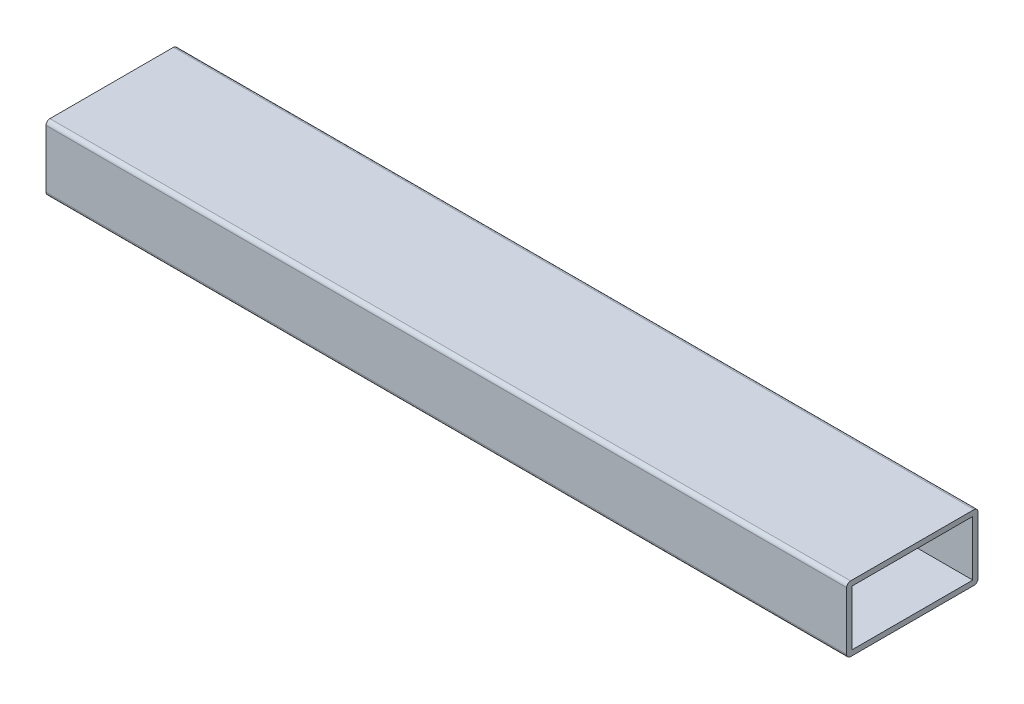
ISO-10303-21;
HEADER;
FILE_DESCRIPTION(('STEP AP214'),'2;1');
FILE_NAME('part.step','',(''),(''),'','','');
FILE_SCHEMA(('AUTOMOTIVE_DESIGN { 1 0 10303 214 1 1 1 1 }'));
ENDSEC;
DATA;
#1=APPLICATION_CONTEXT('core data for automotive mechanical design processes');
#2=APPLICATION_PROTOCOL_DEFINITION('international standard','automotive_design',2000,#1);
#3=PRODUCT_CONTEXT('',#1,'mechanical');
#4=PRODUCT('Part','Part','',(#3));
#5=PRODUCT_RELATED_PRODUCT_CATEGORY('part','',(#4));
#6=PRODUCT_DEFINITION_FORMATION('','',#4);
#7=PRODUCT_DEFINITION_CONTEXT('part definition',#1,'design');
#8=PRODUCT_DEFINITION('design','',#6,#7);
#9=PRODUCT_DEFINITION_SHAPE('','',#8);
#10=(LENGTH_UNIT() NAMED_UNIT(*) SI_UNIT(.MILLI.,.METRE.));
#11=(NAMED_UNIT(*) PLANE_ANGLE_UNIT() SI_UNIT($,.RADIAN.));
#12=(NAMED_UNIT(*) SI_UNIT($,.STERADIAN.) SOLID_ANGLE_UNIT());
#13=UNCERTAINTY_MEASURE_WITH_UNIT(LENGTH_MEASURE(1.E-05),#10,'distance_accuracy_value','');
#14=(GEOMETRIC_REPRESENTATION_CONTEXT(3) GLOBAL_UNCERTAINTY_ASSIGNED_CONTEXT((#13)) GLOBAL_UNIT_ASSIGNED_CONTEXT((#10,
#11,#12)) REPRESENTATION_CONTEXT('',''));
#15=CARTESIAN_POINT('',(0.,0.,0.));
#16=DIRECTION('',(0.,0.,1.));
#17=DIRECTION('',(1.,0.,0.));
#18=AXIS2_PLACEMENT_3D('',#15,#16,#17);
#19=CARTESIAN_POINT('',(152.4,-11.,23.5));
#20=DIRECTION('',(-1.,0.,0.));
#21=DIRECTION('',(0.,0.,1.));
#22=AXIS2_PLACEMENT_3D('',#19,#20,#21);
#23=PLANE('',#22);
#24=CARTESIAN_POINT('',(152.4,-11.,23.5));
#25=DIRECTION('',(1.,0.,0.));
#26=DIRECTION('',(0.,0.,1.));
#27=AXIS2_PLACEMENT_3D('',#24,#25,#26);
#28=CIRCLE('',#27,1.5);
#29=CARTESIAN_POINT('',(152.4,-11.,25.));
#30=VERTEX_POINT('',#29);
#31=CARTESIAN_POINT('',(152.4,-12.5,23.5));
#32=VERTEX_POINT('',#31);
#33=EDGE_CURVE('E159',#30,#32,#28,.T.);
#34=ORIENTED_EDGE('',*,*,#33,.T.);
#35=DIRECTION('',(0.,0.,-1.));
#36=VECTOR('',#35,1.);
#37=CARTESIAN_POINT('',(152.4,-12.5,23.5));
#38=LINE('',#37,#36);
#39=CARTESIAN_POINT('',(152.4,-12.5,-23.5));
#40=VERTEX_POINT('',#39);
#41=EDGE_CURVE('E162',#32,#40,#38,.T.);
#42=ORIENTED_EDGE('',*,*,#41,.T.);
#43=CARTESIAN_POINT('',(152.4,-11.,-23.5));
#44=DIRECTION('',(1.,0.,0.));
#45=DIRECTION('',(0.,0.,-1.));
#46=AXIS2_PLACEMENT_3D('',#43,#44,#45);
#47=CIRCLE('',#46,1.5);
#48=CARTESIAN_POINT('',(152.4,-11.,-25.));
#49=VERTEX_POINT('',#48);
#50=EDGE_CURVE('E165',#40,#49,#47,.T.);
#51=ORIENTED_EDGE('',*,*,#50,.T.);
#52=DIRECTION('',(0.,1.,0.));
#53=VECTOR('',#52,1.);
#54=CARTESIAN_POINT('',(152.4,11.,-25.));
#55=LINE('',#54,#53);
#56=CARTESIAN_POINT('',(152.4,11.,-25.));
#57=VERTEX_POINT('',#56);
#58=EDGE_CURVE('E167',#49,#57,#55,.T.);
#59=ORIENTED_EDGE('',*,*,#58,.T.);
#60=CARTESIAN_POINT('',(152.4,11.,-23.5));
#61=DIRECTION('',(1.,0.,0.));
#62=DIRECTION('',(0.,0.,-1.));
#63=AXIS2_PLACEMENT_3D('',#60,#61,#62);
#64=CIRCLE('',#63,1.5);
#65=CARTESIAN_POINT('',(152.4,12.5,-23.5));
#66=VERTEX_POINT('',#65);
#67=EDGE_CURVE('E169',#57,#66,#64,.T.);
#68=ORIENTED_EDGE('',*,*,#67,.T.);
#69=DIRECTION('',(0.,0.,1.));
#70=VECTOR('',#69,1.);
#71=CARTESIAN_POINT('',(152.4,12.5,23.5));
#72=LINE('',#71,#70);
#73=CARTESIAN_POINT('',(152.4,12.5,23.5));
#74=VERTEX_POINT('',#73);
#75=EDGE_CURVE('E171',#66,#74,#72,.T.);
#76=ORIENTED_EDGE('',*,*,#75,.T.);
#77=CARTESIAN_POINT('',(152.4,11.,23.5));
#78=DIRECTION('',(1.,0.,0.));
#79=DIRECTION('',(0.,0.,1.));
#80=AXIS2_PLACEMENT_3D('',#77,#78,#79);
#81=CIRCLE('',#80,1.5);
#82=CARTESIAN_POINT('',(152.4,11.,25.));
#83=VERTEX_POINT('',#82);
#84=EDGE_CURVE('E173',#74,#83,#81,.T.);
#85=ORIENTED_EDGE('',*,*,#84,.T.);
#86=DIRECTION('',(0.,-1.,0.));
#87=VECTOR('',#86,1.);
#88=CARTESIAN_POINT('',(152.4,11.,25.));
#89=LINE('',#88,#87);
#90=EDGE_CURVE('E175',#83,#30,#89,.T.);
#91=ORIENTED_EDGE('',*,*,#90,.T.);
#92=EDGE_LOOP('',(#34,#42,#51,#59,#68,#76,#85,#91));
#93=FACE_BOUND('',#92,.T.);
#94=DIRECTION('',(0.,-1.,0.));
#95=VECTOR('',#94,1.);
#96=CARTESIAN_POINT('',(152.4,-11.,23.));
#97=LINE('',#96,#95);
#98=CARTESIAN_POINT('',(152.4,10.5,23.));
#99=VERTEX_POINT('',#98);
#100=CARTESIAN_POINT('',(152.4,-10.5,23.));
#101=VERTEX_POINT('',#100);
#102=EDGE_CURVE('E128',#99,#101,#97,.T.);
#103=ORIENTED_EDGE('',*,*,#102,.F.);
#104=DIRECTION('',(0.,0.,1.));
#105=VECTOR('',#104,1.);
#106=CARTESIAN_POINT('',(152.4,10.5,23.5));
#107=LINE('',#106,#105);
#108=CARTESIAN_POINT('',(152.4,10.5,-23.));
#109=VERTEX_POINT('',#108);
#110=EDGE_CURVE('E155',#109,#99,#107,.T.);
#111=ORIENTED_EDGE('',*,*,#110,.F.);
#112=DIRECTION('',(0.,1.,0.));
#113=VECTOR('',#112,1.);
#114=CARTESIAN_POINT('',(152.4,-11.,-23.));
#115=LINE('',#114,#113);
#116=CARTESIAN_POINT('',(152.4,-10.5,-23.));
#117=VERTEX_POINT('',#116);
#118=EDGE_CURVE('E148',#117,#109,#115,.T.);
#119=ORIENTED_EDGE('',*,*,#118,.F.);
#120=DIRECTION('',(0.,0.,-1.));
#121=VECTOR('',#120,1.);
#122=CARTESIAN_POINT('',(152.4,-10.5,23.5));
#123=LINE('',#122,#121);
#124=EDGE_CURVE('E146',#101,#117,#123,.T.);
#125=ORIENTED_EDGE('',*,*,#124,.F.);
#126=EDGE_LOOP('',(#103,#111,#119,#125));
#127=FACE_BOUND('',#126,.T.);
#128=ADVANCED_FACE('F35',(#93,#127),#23,.F.);
#129=CARTESIAN_POINT('',(-152.4,-11.,23.5));
#130=DIRECTION('',(-1.,0.,0.));
#131=DIRECTION('',(0.,0.,1.));
#132=AXIS2_PLACEMENT_3D('',#129,#130,#131);
#133=PLANE('',#132);
#134=CARTESIAN_POINT('',(-152.4,-11.,23.5));
#135=DIRECTION('',(1.,0.,0.));
#136=DIRECTION('',(0.,0.,1.));
#137=AXIS2_PLACEMENT_3D('',#134,#135,#136);
#138=CIRCLE('',#137,1.5);
#139=CARTESIAN_POINT('',(-152.4,-11.,25.));
#140=VERTEX_POINT('',#139);
#141=CARTESIAN_POINT('',(-152.4,-12.5,23.5));
#142=VERTEX_POINT('',#141);
#143=EDGE_CURVE('E131',#140,#142,#138,.T.);
#144=ORIENTED_EDGE('',*,*,#143,.F.);
#145=DIRECTION('',(0.,-1.,0.));
#146=VECTOR('',#145,1.);
#147=CARTESIAN_POINT('',(-152.4,11.,25.));
#148=LINE('',#147,#146);
#149=CARTESIAN_POINT('',(-152.4,11.,25.));
#150=VERTEX_POINT('',#149);
#151=EDGE_CURVE('E163',#150,#140,#148,.T.);
#152=ORIENTED_EDGE('',*,*,#151,.F.);
#153=CARTESIAN_POINT('',(-152.4,11.,23.5));
#154=DIRECTION('',(1.,0.,0.));
#155=DIRECTION('',(0.,0.,1.));
#156=AXIS2_PLACEMENT_3D('',#153,#154,#155);
#157=CIRCLE('',#156,1.5);
#158=CARTESIAN_POINT('',(-152.4,12.5,23.5));
#159=VERTEX_POINT('',#158);
#160=EDGE_CURVE('E190',#159,#150,#157,.T.);
#161=ORIENTED_EDGE('',*,*,#160,.F.);
#162=DIRECTION('',(0.,0.,1.));
#163=VECTOR('',#162,1.);
#164=CARTESIAN_POINT('',(-152.4,12.5,23.5));
#165=LINE('',#164,#163);
#166=CARTESIAN_POINT('',(-152.4,12.5,-23.5));
#167=VERTEX_POINT('',#166);
#168=EDGE_CURVE('E188',#167,#159,#165,.T.);
#169=ORIENTED_EDGE('',*,*,#168,.F.);
#170=CARTESIAN_POINT('',(-152.4,11.,-23.5));
#171=DIRECTION('',(1.,0.,0.));
#172=DIRECTION('',(0.,0.,-1.));
#173=AXIS2_PLACEMENT_3D('',#170,#171,#172);
#174=CIRCLE('',#173,1.5);
#175=CARTESIAN_POINT('',(-152.4,11.,-25.));
#176=VERTEX_POINT('',#175);
#177=EDGE_CURVE('E186',#176,#167,#174,.T.);
#178=ORIENTED_EDGE('',*,*,#177,.F.);
#179=DIRECTION('',(0.,1.,0.));
#180=VECTOR('',#179,1.);
#181=CARTESIAN_POINT('',(-152.4,11.,-25.));
#182=LINE('',#181,#180);
#183=CARTESIAN_POINT('',(-152.4,-11.,-25.));
#184=VERTEX_POINT('',#183);
#185=EDGE_CURVE('E184',#184,#176,#182,.T.);
#186=ORIENTED_EDGE('',*,*,#185,.F.);
#187=CARTESIAN_POINT('',(-152.4,-11.,-23.5));
#188=DIRECTION('',(1.,0.,0.));
#189=DIRECTION('',(0.,0.,-1.));
#190=AXIS2_PLACEMENT_3D('',#187,#188,#189);
#191=CIRCLE('',#190,1.5);
#192=CARTESIAN_POINT('',(-152.4,-12.5,-23.5));
#193=VERTEX_POINT('',#192);
#194=EDGE_CURVE('E182',#193,#184,#191,.T.);
#195=ORIENTED_EDGE('',*,*,#194,.F.);
#196=DIRECTION('',(0.,0.,-1.));
#197=VECTOR('',#196,1.);
#198=CARTESIAN_POINT('',(-152.4,-12.5,23.5));
#199=LINE('',#198,#197);
#200=EDGE_CURVE('E180',#142,#193,#199,.T.);
#201=ORIENTED_EDGE('',*,*,#200,.F.);
#202=EDGE_LOOP('',(#144,#152,#161,#169,#178,#186,#195,#201));
#203=FACE_BOUND('',#202,.T.);
#204=DIRECTION('',(0.,-1.,0.));
#205=VECTOR('',#204,1.);
#206=CARTESIAN_POINT('',(-152.4,-11.,23.));
#207=LINE('',#206,#205);
#208=CARTESIAN_POINT('',(-152.4,10.5,23.));
#209=VERTEX_POINT('',#208);
#210=CARTESIAN_POINT('',(-152.4,-10.5,23.));
#211=VERTEX_POINT('',#210);
#212=EDGE_CURVE('E125',#209,#211,#207,.T.);
#213=ORIENTED_EDGE('',*,*,#212,.T.);
#214=DIRECTION('',(0.,0.,-1.));
#215=VECTOR('',#214,1.);
#216=CARTESIAN_POINT('',(-152.4,-10.5,23.5));
#217=LINE('',#216,#215);
#218=CARTESIAN_POINT('',(-152.4,-10.5,-23.));
#219=VERTEX_POINT('',#218);
#220=EDGE_CURVE('E136',#211,#219,#217,.T.);
#221=ORIENTED_EDGE('',*,*,#220,.T.);
#222=DIRECTION('',(0.,1.,0.));
#223=VECTOR('',#222,1.);
#224=CARTESIAN_POINT('',(-152.4,-11.,-23.));
#225=LINE('',#224,#223);
#226=CARTESIAN_POINT('',(-152.4,10.5,-23.));
#227=VERTEX_POINT('',#226);
#228=EDGE_CURVE('E141',#219,#227,#225,.T.);
#229=ORIENTED_EDGE('',*,*,#228,.T.);
#230=DIRECTION('',(0.,0.,1.));
#231=VECTOR('',#230,1.);
#232=CARTESIAN_POINT('',(-152.4,10.5,23.5));
#233=LINE('',#232,#231);
#234=EDGE_CURVE('E145',#227,#209,#233,.T.);
#235=ORIENTED_EDGE('',*,*,#234,.T.);
#236=EDGE_LOOP('',(#213,#221,#229,#235));
#237=FACE_BOUND('',#236,.T.);
#238=ADVANCED_FACE('F144',(#203,#237),#133,.T.);
#239=CARTESIAN_POINT('',(152.4,-11.,23.5));
#240=DIRECTION('',(-1.,0.,0.));
#241=DIRECTION('',(0.,0.,1.));
#242=AXIS2_PLACEMENT_3D('',#239,#240,#241);
#243=CYLINDRICAL_SURFACE('',#242,1.5);
#244=ORIENTED_EDGE('',*,*,#143,.T.);
#245=DIRECTION('',(-1.,0.,0.));
#246=VECTOR('',#245,1.);
#247=CARTESIAN_POINT('',(152.4,-12.5,23.5));
#248=LINE('',#247,#246);
#249=EDGE_CURVE('E11',#32,#142,#248,.T.);
#250=ORIENTED_EDGE('',*,*,#249,.F.);
#251=ORIENTED_EDGE('',*,*,#33,.F.);
#252=DIRECTION('',(-1.,0.,0.));
#253=VECTOR('',#252,1.);
#254=CARTESIAN_POINT('',(152.4,-11.,25.));
#255=LINE('',#254,#253);
#256=EDGE_CURVE('E177',#30,#140,#255,.T.);
#257=ORIENTED_EDGE('',*,*,#256,.T.);
#258=EDGE_LOOP('',(#244,#250,#251,#257));
#259=FACE_BOUND('',#258,.T.);
#260=ADVANCED_FACE('F37',(#259),#243,.T.);
#261=CARTESIAN_POINT('',(152.4,-12.5,23.5));
#262=DIRECTION('',(0.,1.,0.));
#263=DIRECTION('',(0.,0.,1.));
#264=AXIS2_PLACEMENT_3D('',#261,#262,#263);
#265=PLANE('',#264);
#266=ORIENTED_EDGE('',*,*,#200,.T.);
#267=DIRECTION('',(-1.,0.,0.));
#268=VECTOR('',#267,1.);
#269=CARTESIAN_POINT('',(152.4,-12.5,-23.5));
#270=LINE('',#269,#268);
#271=EDGE_CURVE('E43',#40,#193,#270,.T.);
#272=ORIENTED_EDGE('',*,*,#271,.F.);
#273=ORIENTED_EDGE('',*,*,#41,.F.);
#274=ORIENTED_EDGE('',*,*,#249,.T.);
#275=EDGE_LOOP('',(#266,#272,#273,#274));
#276=FACE_BOUND('',#275,.T.);
#277=ADVANCED_FACE('F236',(#276),#265,.F.);
#278=CARTESIAN_POINT('',(152.4,-11.,-23.5));
#279=DIRECTION('',(-1.,0.,0.));
#280=DIRECTION('',(0.,0.,1.));
#281=AXIS2_PLACEMENT_3D('',#278,#279,#280);
#282=CYLINDRICAL_SURFACE('',#281,1.5);
#283=ORIENTED_EDGE('',*,*,#194,.T.);
#284=DIRECTION('',(-1.,0.,0.));
#285=VECTOR('',#284,1.);
#286=CARTESIAN_POINT('',(152.4,-11.,-25.));
#287=LINE('',#286,#285);
#288=EDGE_CURVE('E207',#49,#184,#287,.T.);
#289=ORIENTED_EDGE('',*,*,#288,.F.);
#290=ORIENTED_EDGE('',*,*,#50,.F.);
#291=ORIENTED_EDGE('',*,*,#271,.T.);
#292=EDGE_LOOP('',(#283,#289,#290,#291));
#293=FACE_BOUND('',#292,.T.);
#294=ADVANCED_FACE('F214',(#293),#282,.T.);
#295=CARTESIAN_POINT('',(152.4,11.,-25.));
#296=DIRECTION('',(0.,0.,1.));
#297=DIRECTION('',(0.,-1.,0.));
#298=AXIS2_PLACEMENT_3D('',#295,#296,#297);
#299=PLANE('',#298);
#300=ORIENTED_EDGE('',*,*,#185,.T.);
#301=DIRECTION('',(-1.,0.,0.));
#302=VECTOR('',#301,1.);
#303=CARTESIAN_POINT('',(152.4,11.,-25.));
#304=LINE('',#303,#302);
#305=EDGE_CURVE('E204',#57,#176,#304,.T.);
#306=ORIENTED_EDGE('',*,*,#305,.F.);
#307=ORIENTED_EDGE('',*,*,#58,.F.);
#308=ORIENTED_EDGE('',*,*,#288,.T.);
#309=EDGE_LOOP('',(#300,#306,#307,#308));
#310=FACE_BOUND('',#309,.T.);
#311=ADVANCED_FACE('F224',(#310),#299,.F.);
#312=CARTESIAN_POINT('',(152.4,11.,-23.5));
#313=DIRECTION('',(-1.,0.,0.));
#314=DIRECTION('',(0.,0.,1.));
#315=AXIS2_PLACEMENT_3D('',#312,#313,#314);
#316=CYLINDRICAL_SURFACE('',#315,1.5);
#317=ORIENTED_EDGE('',*,*,#177,.T.);
#318=DIRECTION('',(-1.,0.,0.));
#319=VECTOR('',#318,1.);
#320=CARTESIAN_POINT('',(152.4,12.5,-23.5));
#321=LINE('',#320,#319);
#322=EDGE_CURVE('E201',#66,#167,#321,.T.);
#323=ORIENTED_EDGE('',*,*,#322,.F.);
#324=ORIENTED_EDGE('',*,*,#67,.F.);
#325=ORIENTED_EDGE('',*,*,#305,.T.);
#326=EDGE_LOOP('',(#317,#323,#324,#325));
#327=FACE_BOUND('',#326,.T.);
#328=ADVANCED_FACE('F228',(#327),#316,.T.);
#329=CARTESIAN_POINT('',(152.4,12.5,23.5));
#330=DIRECTION('',(0.,-1.,0.));
#331=DIRECTION('',(0.,0.,-1.));
#332=AXIS2_PLACEMENT_3D('',#329,#330,#331);
#333=PLANE('',#332);
#334=ORIENTED_EDGE('',*,*,#168,.T.);
#335=DIRECTION('',(-1.,0.,0.));
#336=VECTOR('',#335,1.);
#337=CARTESIAN_POINT('',(152.4,12.5,23.5));
#338=LINE('',#337,#336);
#339=EDGE_CURVE('E198',#74,#159,#338,.T.);
#340=ORIENTED_EDGE('',*,*,#339,.F.);
#341=ORIENTED_EDGE('',*,*,#75,.F.);
#342=ORIENTED_EDGE('',*,*,#322,.T.);
#343=EDGE_LOOP('',(#334,#340,#341,#342));
#344=FACE_BOUND('',#343,.T.);
#345=ADVANCED_FACE('F249',(#344),#333,.F.);
#346=CARTESIAN_POINT('',(152.4,11.,23.5));
#347=DIRECTION('',(-1.,0.,0.));
#348=DIRECTION('',(0.,0.,1.));
#349=AXIS2_PLACEMENT_3D('',#346,#347,#348);
#350=CYLINDRICAL_SURFACE('',#349,1.5);
#351=ORIENTED_EDGE('',*,*,#160,.T.);
#352=DIRECTION('',(-1.,0.,0.));
#353=VECTOR('',#352,1.);
#354=CARTESIAN_POINT('',(152.4,11.,25.));
#355=LINE('',#354,#353);
#356=EDGE_CURVE('E195',#83,#150,#355,.T.);
#357=ORIENTED_EDGE('',*,*,#356,.F.);
#358=ORIENTED_EDGE('',*,*,#84,.F.);
#359=ORIENTED_EDGE('',*,*,#339,.T.);
#360=EDGE_LOOP('',(#351,#357,#358,#359));
#361=FACE_BOUND('',#360,.T.);
#362=ADVANCED_FACE('F247',(#361),#350,.T.);
#363=CARTESIAN_POINT('',(152.4,11.,25.));
#364=DIRECTION('',(0.,0.,-1.));
#365=DIRECTION('',(0.,1.,0.));
#366=AXIS2_PLACEMENT_3D('',#363,#364,#365);
#367=PLANE('',#366);
#368=ORIENTED_EDGE('',*,*,#151,.T.);
#369=ORIENTED_EDGE('',*,*,#256,.F.);
#370=ORIENTED_EDGE('',*,*,#90,.F.);
#371=ORIENTED_EDGE('',*,*,#356,.T.);
#372=EDGE_LOOP('',(#368,#369,#370,#371));
#373=FACE_BOUND('',#372,.T.);
#374=ADVANCED_FACE('F242',(#373),#367,.F.);
#375=CARTESIAN_POINT('',(152.4,-10.5,23.5));
#376=DIRECTION('',(0.,1.,0.));
#377=DIRECTION('',(0.,0.,1.));
#378=AXIS2_PLACEMENT_3D('',#375,#376,#377);
#379=PLANE('',#378);
#380=ORIENTED_EDGE('',*,*,#220,.F.);
#381=DIRECTION('',(-1.,0.,0.));
#382=VECTOR('',#381,1.);
#383=CARTESIAN_POINT('',(152.4,-10.5,23.));
#384=LINE('',#383,#382);
#385=EDGE_CURVE('E120',#101,#211,#384,.T.);
#386=ORIENTED_EDGE('',*,*,#385,.F.);
#387=ORIENTED_EDGE('',*,*,#124,.T.);
#388=DIRECTION('',(-1.,0.,0.));
#389=VECTOR('',#388,1.);
#390=CARTESIAN_POINT('',(152.4,-10.5,-23.));
#391=LINE('',#390,#389);
#392=EDGE_CURVE('E132',#117,#219,#391,.T.);
#393=ORIENTED_EDGE('',*,*,#392,.T.);
#394=EDGE_LOOP('',(#380,#386,#387,#393));
#395=FACE_BOUND('',#394,.T.);
#396=ADVANCED_FACE('F137',(#395),#379,.T.);
#397=CARTESIAN_POINT('',(152.4,11.,-23.));
#398=DIRECTION('',(0.,0.,1.));
#399=DIRECTION('',(0.,-1.,0.));
#400=AXIS2_PLACEMENT_3D('',#397,#398,#399);
#401=PLANE('',#400);
#402=ORIENTED_EDGE('',*,*,#228,.F.);
#403=ORIENTED_EDGE('',*,*,#392,.F.);
#404=ORIENTED_EDGE('',*,*,#118,.T.);
#405=DIRECTION('',(-1.,0.,0.));
#406=VECTOR('',#405,1.);
#407=CARTESIAN_POINT('',(152.4,10.5,-23.));
#408=LINE('',#407,#406);
#409=EDGE_CURVE('E50',#109,#227,#408,.T.);
#410=ORIENTED_EDGE('',*,*,#409,.T.);
#411=EDGE_LOOP('',(#402,#403,#404,#410));
#412=FACE_BOUND('',#411,.T.);
#413=ADVANCED_FACE('F271',(#412),#401,.T.);
#414=CARTESIAN_POINT('',(152.4,10.5,23.5));
#415=DIRECTION('',(0.,-1.,0.));
#416=DIRECTION('',(0.,0.,-1.));
#417=AXIS2_PLACEMENT_3D('',#414,#415,#416);
#418=PLANE('',#417);
#419=ORIENTED_EDGE('',*,*,#234,.F.);
#420=ORIENTED_EDGE('',*,*,#409,.F.);
#421=ORIENTED_EDGE('',*,*,#110,.T.);
#422=DIRECTION('',(-1.,0.,0.));
#423=VECTOR('',#422,1.);
#424=CARTESIAN_POINT('',(152.4,10.5,23.));
#425=LINE('',#424,#423);
#426=EDGE_CURVE('E158',#99,#209,#425,.T.);
#427=ORIENTED_EDGE('',*,*,#426,.T.);
#428=EDGE_LOOP('',(#419,#420,#421,#427));
#429=FACE_BOUND('',#428,.T.);
#430=ADVANCED_FACE('F276',(#429),#418,.T.);
#431=CARTESIAN_POINT('',(152.4,11.,23.));
#432=DIRECTION('',(0.,0.,-1.));
#433=DIRECTION('',(0.,1.,0.));
#434=AXIS2_PLACEMENT_3D('',#431,#432,#433);
#435=PLANE('',#434);
#436=ORIENTED_EDGE('',*,*,#212,.F.);
#437=ORIENTED_EDGE('',*,*,#426,.F.);
#438=ORIENTED_EDGE('',*,*,#102,.T.);
#439=ORIENTED_EDGE('',*,*,#385,.T.);
#440=EDGE_LOOP('',(#436,#437,#438,#439));
#441=FACE_BOUND('',#440,.T.);
#442=ADVANCED_FACE('F122',(#441),#435,.T.);
#443=CLOSED_SHELL('',(#128,#238,#260,#277,#294,#311,#328,#345,#362,#374,#396,#413,#430,#442));
#444=MANIFOLD_SOLID_BREP('B2',#443);
#445=ADVANCED_BREP_SHAPE_REPRESENTATION('',(#18,#444),#14);
#446=SHAPE_DEFINITION_REPRESENTATION(#9,#445);
ENDSEC;
END-ISO-10303-21;
